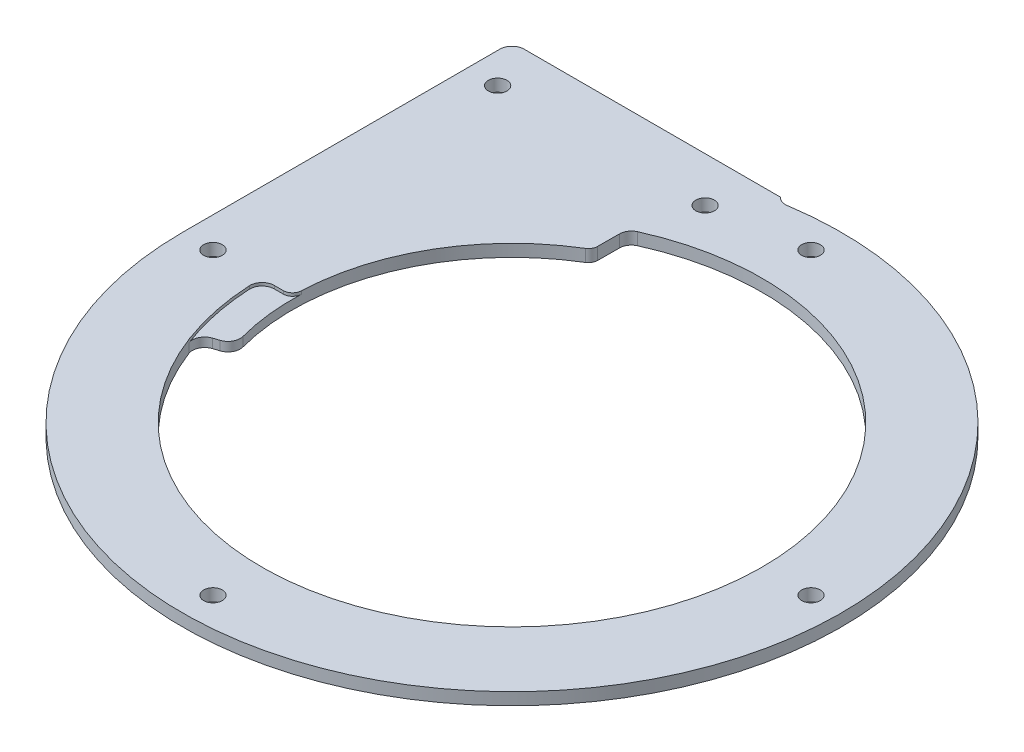
ISO-10303-21;
HEADER;
FILE_DESCRIPTION(('STEP AP214'),'2;1');
FILE_NAME('part.step','',(''),(''),'','','');
FILE_SCHEMA(('AUTOMOTIVE_DESIGN { 1 0 10303 214 1 1 1 1 }'));
ENDSEC;
DATA;
#1=APPLICATION_CONTEXT('core data for automotive mechanical design processes');
#2=APPLICATION_PROTOCOL_DEFINITION('international standard','automotive_design',2000,#1);
#3=PRODUCT_CONTEXT('',#1,'mechanical');
#4=PRODUCT('Part','Part','',(#3));
#5=PRODUCT_RELATED_PRODUCT_CATEGORY('part','',(#4));
#6=PRODUCT_DEFINITION_FORMATION('','',#4);
#7=PRODUCT_DEFINITION_CONTEXT('part definition',#1,'design');
#8=PRODUCT_DEFINITION('design','',#6,#7);
#9=PRODUCT_DEFINITION_SHAPE('','',#8);
#10=(LENGTH_UNIT() NAMED_UNIT(*) SI_UNIT(.MILLI.,.METRE.));
#11=(NAMED_UNIT(*) PLANE_ANGLE_UNIT() SI_UNIT($,.RADIAN.));
#12=(NAMED_UNIT(*) SI_UNIT($,.STERADIAN.) SOLID_ANGLE_UNIT());
#13=UNCERTAINTY_MEASURE_WITH_UNIT(LENGTH_MEASURE(1.E-05),#10,'distance_accuracy_value','');
#14=(GEOMETRIC_REPRESENTATION_CONTEXT(3) GLOBAL_UNCERTAINTY_ASSIGNED_CONTEXT((#13)) GLOBAL_UNIT_ASSIGNED_CONTEXT((#10,
#11,#12)) REPRESENTATION_CONTEXT('',''));
#15=CARTESIAN_POINT('',(0.,0.,0.));
#16=DIRECTION('',(0.,0.,1.));
#17=DIRECTION('',(1.,0.,0.));
#18=AXIS2_PLACEMENT_3D('',#15,#16,#17);
#19=CARTESIAN_POINT('',(-41.,45.4533796671224,0.));
#20=DIRECTION('',(0.,0.,-1.));
#21=DIRECTION('',(-1.,0.,0.));
#22=AXIS2_PLACEMENT_3D('',#19,#20,#21);
#23=PLANE('',#22);
#24=DIRECTION('',(1.,0.,0.));
#25=VECTOR('',#24,1.);
#26=CARTESIAN_POINT('',(-38.9486841883009,1.5,0.));
#27=LINE('',#26,#25);
#28=CARTESIAN_POINT('',(-38.9486841883009,1.5,0.));
#29=VERTEX_POINT('',#28);
#30=CARTESIAN_POINT('',(-37.4699879903904,1.5,0.));
#31=VERTEX_POINT('',#30);
#32=EDGE_CURVE('E177',#29,#31,#27,.T.);
#33=ORIENTED_EDGE('',*,*,#32,.T.);
#34=DIRECTION('',(0.,-1.,0.));
#35=VECTOR('',#34,1.);
#36=CARTESIAN_POINT('',(-37.4699879903904,45.4533796671224,0.));
#37=LINE('',#36,#35);
#38=CARTESIAN_POINT('',(-37.4699879903904,2.,0.));
#39=VERTEX_POINT('',#38);
#40=EDGE_CURVE('E161',#39,#31,#37,.T.);
#41=ORIENTED_EDGE('',*,*,#40,.F.);
#42=DIRECTION('',(1.,0.,0.));
#43=VECTOR('',#42,1.);
#44=CARTESIAN_POINT('',(-41.,2.,0.));
#45=LINE('',#44,#43);
#46=CARTESIAN_POINT('',(-38.9486841883009,2.,0.));
#47=VERTEX_POINT('',#46);
#48=EDGE_CURVE('E216',#47,#39,#45,.T.);
#49=ORIENTED_EDGE('',*,*,#48,.F.);
#50=DIRECTION('',(0.,-1.,0.));
#51=VECTOR('',#50,1.);
#52=CARTESIAN_POINT('',(-38.9486841883009,45.4533796671224,0.));
#53=LINE('',#52,#51);
#54=EDGE_CURVE('E181',#47,#29,#53,.T.);
#55=ORIENTED_EDGE('',*,*,#54,.T.);
#56=EDGE_LOOP('',(#33,#41,#49,#55));
#57=FACE_BOUND('',#56,.T.);
#58=ADVANCED_FACE('F44',(#57),#23,.F.);
#59=CARTESIAN_POINT('',(-37.4699879903904,45.4533796671224,-1.50000000000001));
#60=DIRECTION('',(0.,-1.,0.));
#61=DIRECTION('',(0.,0.,-1.));
#62=AXIS2_PLACEMENT_3D('',#59,#60,#61);
#63=CYLINDRICAL_SURFACE('',#62,1.50000000000001);
#64=CARTESIAN_POINT('',(-37.4699879903904,1.5,-1.50000000000001));
#65=DIRECTION('',(0.,1.,0.));
#66=DIRECTION('',(0.,0.,-1.));
#67=AXIS2_PLACEMENT_3D('',#64,#65,#66);
#68=CIRCLE('',#67,1.5);
#69=CARTESIAN_POINT('',(-35.9711884707748,1.5,-1.44000000000002));
#70=VERTEX_POINT('',#69);
#71=EDGE_CURVE('E170',#31,#70,#68,.T.);
#72=ORIENTED_EDGE('',*,*,#71,.T.);
#73=DIRECTION('',(0.,-1.,0.));
#74=VECTOR('',#73,1.);
#75=CARTESIAN_POINT('',(-35.9711884707748,45.4533796671224,-1.44000000000002));
#76=LINE('',#75,#74);
#77=CARTESIAN_POINT('',(-35.9711884707748,2.,-1.44000000000002));
#78=VERTEX_POINT('',#77);
#79=EDGE_CURVE('E172',#78,#70,#76,.T.);
#80=ORIENTED_EDGE('',*,*,#79,.F.);
#81=CARTESIAN_POINT('',(-37.4699879903904,2.,-1.50000000000001));
#82=DIRECTION('',(0.,1.,0.));
#83=DIRECTION('',(0.,0.,1.));
#84=AXIS2_PLACEMENT_3D('',#81,#82,#83);
#85=CIRCLE('',#84,1.50000000000001);
#86=EDGE_CURVE('E167',#39,#78,#85,.T.);
#87=ORIENTED_EDGE('',*,*,#86,.F.);
#88=ORIENTED_EDGE('',*,*,#40,.T.);
#89=EDGE_LOOP('',(#72,#80,#87,#88));
#90=FACE_BOUND('',#89,.T.);
#91=ADVANCED_FACE('F164',(#90),#63,.T.);
#92=CARTESIAN_POINT('',(0.,2.,0.));
#93=DIRECTION('',(0.,-1.,0.));
#94=DIRECTION('',(0.,0.,-1.));
#95=AXIS2_PLACEMENT_3D('',#92,#93,#94);
#96=CYLINDRICAL_SURFACE('',#95,41.);
#97=CARTESIAN_POINT('',(0.,0.,0.));
#98=DIRECTION('',(0.,1.,0.));
#99=DIRECTION('',(0.,0.,1.));
#100=AXIS2_PLACEMENT_3D('',#97,#98,#99);
#101=CIRCLE('',#100,41.);
#102=CARTESIAN_POINT('',(-38.2922821101508,0.,14.6526833991806));
#103=VERTEX_POINT('',#102);
#104=CARTESIAN_POINT('',(-16.7986572287805,0.,-37.4006031409915));
#105=VERTEX_POINT('',#104);
#106=EDGE_CURVE('E281',#103,#105,#101,.T.);
#107=ORIENTED_EDGE('',*,*,#106,.F.);
#108=DIRECTION('',(0.,-1.,0.));
#109=VECTOR('',#108,1.);
#110=CARTESIAN_POINT('',(-38.2922821101508,2.,14.6526833991806));
#111=LINE('',#110,#109);
#112=CARTESIAN_POINT('',(-38.2922821101508,1.5,14.6526833991806));
#113=VERTEX_POINT('',#112);
#114=EDGE_CURVE('E384',#103,#113,#111,.F.);
#115=ORIENTED_EDGE('',*,*,#114,.T.);
#116=CARTESIAN_POINT('',(0.,1.5,0.));
#117=DIRECTION('',(0.,-1.,0.));
#118=DIRECTION('',(0.,0.,-1.));
#119=AXIS2_PLACEMENT_3D('',#116,#117,#118);
#120=CIRCLE('',#119,41.);
#121=CARTESIAN_POINT('',(-40.9460526082138,1.5,2.10256410256411));
#122=VERTEX_POINT('',#121);
#123=EDGE_CURVE('E58',#113,#122,#120,.T.);
#124=ORIENTED_EDGE('',*,*,#123,.T.);
#125=DIRECTION('',(0.,-1.,0.));
#126=VECTOR('',#125,1.);
#127=CARTESIAN_POINT('',(-40.9460526082138,2.,2.10256410256411));
#128=LINE('',#127,#126);
#129=CARTESIAN_POINT('',(-40.9460526082138,2.,2.10256410256411));
#130=VERTEX_POINT('',#129);
#131=EDGE_CURVE('E322',#122,#130,#128,.F.);
#132=ORIENTED_EDGE('',*,*,#131,.T.);
#133=CARTESIAN_POINT('',(0.,2.,0.));
#134=DIRECTION('',(0.,1.,0.));
#135=DIRECTION('',(0.,0.,1.));
#136=AXIS2_PLACEMENT_3D('',#133,#134,#135);
#137=CIRCLE('',#136,41.);
#138=CARTESIAN_POINT('',(-16.7986572287805,2.,-37.4006031409915));
#139=VERTEX_POINT('',#138);
#140=EDGE_CURVE('E290',#130,#139,#137,.T.);
#141=ORIENTED_EDGE('',*,*,#140,.T.);
#142=DIRECTION('',(0.,-1.,0.));
#143=VECTOR('',#142,1.);
#144=CARTESIAN_POINT('',(-16.7986572287805,2.,-37.4006031409915));
#145=LINE('',#144,#143);
#146=EDGE_CURVE('E328',#139,#105,#145,.T.);
#147=ORIENTED_EDGE('',*,*,#146,.T.);
#148=EDGE_LOOP('',(#107,#115,#124,#132,#141,#147));
#149=FACE_BOUND('',#148,.T.);
#150=ADVANCED_FACE('F400',(#149),#96,.F.);
#151=CARTESIAN_POINT('',(0.,2.,0.));
#152=DIRECTION('',(0.,1.,0.));
#153=DIRECTION('',(0.,0.,1.));
#154=AXIS2_PLACEMENT_3D('',#151,#152,#153);
#155=PLANE('',#154);
#156=CARTESIAN_POINT('',(-49.,2.,0.));
#157=DIRECTION('',(0.,1.,0.));
#158=DIRECTION('',(0.,0.,1.));
#159=AXIS2_PLACEMENT_3D('',#156,#157,#158);
#160=CIRCLE('',#159,1.525);
#161=CARTESIAN_POINT('',(-49.,2.,1.525));
#162=VERTEX_POINT('',#161);
#163=EDGE_CURVE('E250',#162,#162,#160,.T.);
#164=ORIENTED_EDGE('',*,*,#163,.F.);
#165=EDGE_LOOP('',(#164));
#166=FACE_BOUND('',#165,.T.);
#167=CARTESIAN_POINT('',(49.,2.,0.));
#168=DIRECTION('',(0.,1.,0.));
#169=DIRECTION('',(0.,0.,1.));
#170=AXIS2_PLACEMENT_3D('',#167,#168,#169);
#171=CIRCLE('',#170,1.525);
#172=CARTESIAN_POINT('',(49.,2.,1.52499999999999));
#173=VERTEX_POINT('',#172);
#174=EDGE_CURVE('E261',#173,#173,#171,.T.);
#175=ORIENTED_EDGE('',*,*,#174,.F.);
#176=EDGE_LOOP('',(#175));
#177=FACE_BOUND('',#176,.T.);
#178=CARTESIAN_POINT('',(-15.,2.,-46.6476151587624));
#179=DIRECTION('',(0.,1.,0.));
#180=DIRECTION('',(0.,0.,1.));
#181=AXIS2_PLACEMENT_3D('',#178,#179,#180);
#182=CIRCLE('',#181,1.525);
#183=CARTESIAN_POINT('',(-15.,2.,-45.1226151587624));
#184=VERTEX_POINT('',#183);
#185=EDGE_CURVE('E280',#184,#184,#182,.T.);
#186=ORIENTED_EDGE('',*,*,#185,.F.);
#187=EDGE_LOOP('',(#186));
#188=FACE_BOUND('',#187,.T.);
#189=DIRECTION('',(-1.,0.,0.));
#190=VECTOR('',#189,1.);
#191=CARTESIAN_POINT('',(-54.,2.,-54.));
#192=LINE('',#191,#190);
#193=CARTESIAN_POINT('',(-10.,2.,-54.));
#194=VERTEX_POINT('',#193);
#195=CARTESIAN_POINT('',(-52.,2.,-54.));
#196=VERTEX_POINT('',#195);
#197=EDGE_CURVE('E296',#194,#196,#192,.T.);
#198=ORIENTED_EDGE('',*,*,#197,.T.);
#199=CARTESIAN_POINT('',(-52.,2.,-52.));
#200=DIRECTION('',(0.,1.,0.));
#201=DIRECTION('',(0.,0.,1.));
#202=AXIS2_PLACEMENT_3D('',#199,#200,#201);
#203=CIRCLE('',#202,2.);
#204=CARTESIAN_POINT('',(-54.,2.,-52.));
#205=VERTEX_POINT('',#204);
#206=EDGE_CURVE('E353',#196,#205,#203,.T.);
#207=ORIENTED_EDGE('',*,*,#206,.T.);
#208=DIRECTION('',(0.,0.,1.));
#209=VECTOR('',#208,1.);
#210=CARTESIAN_POINT('',(-54.,2.,0.));
#211=LINE('',#210,#209);
#212=CARTESIAN_POINT('',(-54.,2.,0.));
#213=VERTEX_POINT('',#212);
#214=EDGE_CURVE('E303',#205,#213,#211,.T.);
#215=ORIENTED_EDGE('',*,*,#214,.T.);
#216=CARTESIAN_POINT('',(0.,2.,0.));
#217=DIRECTION('',(0.,1.,0.));
#218=DIRECTION('',(0.,0.,1.));
#219=AXIS2_PLACEMENT_3D('',#216,#217,#218);
#220=CIRCLE('',#219,54.);
#221=CARTESIAN_POINT('',(-8.21791887795999,2.,-53.3710203136053));
#222=VERTEX_POINT('',#221);
#223=EDGE_CURVE('E295',#213,#222,#220,.T.);
#224=ORIENTED_EDGE('',*,*,#223,.T.);
#225=CARTESIAN_POINT('',(-8.52228624381037,2.,-55.3477247696648));
#226=DIRECTION('',(0.,1.,0.));
#227=DIRECTION('',(0.,0.,1.));
#228=AXIS2_PLACEMENT_3D('',#225,#226,#227);
#229=CIRCLE('',#228,2.);
#230=EDGE_CURVE('E361',#222,#194,#229,.F.);
#231=ORIENTED_EDGE('',*,*,#230,.T.);
#232=EDGE_LOOP('',(#198,#207,#215,#224,#231));
#233=FACE_BOUND('',#232,.T.);
#234=ORIENTED_EDGE('',*,*,#140,.F.);
#235=CARTESIAN_POINT('',(-38.9486841883009,2.,2.00000000000001));
#236=DIRECTION('',(0.,1.,0.));
#237=DIRECTION('',(0.,0.,1.));
#238=AXIS2_PLACEMENT_3D('',#235,#236,#237);
#239=CIRCLE('',#238,2.);
#240=EDGE_CURVE('E343',#130,#47,#239,.F.);
#241=ORIENTED_EDGE('',*,*,#240,.T.);
#242=ORIENTED_EDGE('',*,*,#48,.T.);
#243=ORIENTED_EDGE('',*,*,#86,.T.);
#244=CARTESIAN_POINT('',(0.,2.,0.));
#245=DIRECTION('',(0.,1.,0.));
#246=DIRECTION('',(0.,0.,1.));
#247=AXIS2_PLACEMENT_3D('',#244,#245,#246);
#248=CIRCLE('',#247,36.);
#249=CARTESIAN_POINT('',(-18.7161333475187,2.,-30.7523389763754));
#250=VERTEX_POINT('',#249);
#251=EDGE_CURVE('E207',#78,#250,#248,.F.);
#252=ORIENTED_EDGE('',*,*,#251,.T.);
#253=CARTESIAN_POINT('',(-19.4959722369986,2.,-32.0336864337244));
#254=DIRECTION('',(0.,1.,0.));
#255=DIRECTION('',(0.,0.,1.));
#256=AXIS2_PLACEMENT_3D('',#253,#254,#255);
#257=CIRCLE('',#256,1.5);
#258=CARTESIAN_POINT('',(-17.9959889497554,2.,-32.0266056152006));
#259=VERTEX_POINT('',#258);
#260=EDGE_CURVE('E224',#250,#259,#257,.T.);
#261=ORIENTED_EDGE('',*,*,#260,.T.);
#262=DIRECTION('',(0.00472054568255677,0.,-0.999988858162159));
#263=VECTOR('',#262,1.);
#264=CARTESIAN_POINT('',(-17.9959889497554,2.,-32.0266056152006));
#265=LINE('',#264,#263);
#266=CARTESIAN_POINT('',(-17.9791882510179,2.,-35.5856245669424));
#267=VERTEX_POINT('',#266);
#268=EDGE_CURVE('E221',#259,#267,#265,.T.);
#269=ORIENTED_EDGE('',*,*,#268,.T.);
#270=CARTESIAN_POINT('',(-15.9792105346936,2.,-35.5761834755773));
#271=DIRECTION('',(0.,1.,0.));
#272=DIRECTION('',(0.,0.,1.));
#273=AXIS2_PLACEMENT_3D('',#270,#271,#272);
#274=CIRCLE('',#273,2.);
#275=EDGE_CURVE('E336',#267,#139,#274,.F.);
#276=ORIENTED_EDGE('',*,*,#275,.T.);
#277=EDGE_LOOP('',(#234,#241,#242,#243,#252,#261,#269,#276));
#278=FACE_BOUND('',#277,.T.);
#279=CARTESIAN_POINT('',(0.,2.,-49.));
#280=DIRECTION('',(0.,1.,0.));
#281=DIRECTION('',(0.,0.,1.));
#282=AXIS2_PLACEMENT_3D('',#279,#280,#281);
#283=CIRCLE('',#282,1.525);
#284=CARTESIAN_POINT('',(0.,2.,-47.475));
#285=VERTEX_POINT('',#284);
#286=EDGE_CURVE('E272',#285,#285,#283,.T.);
#287=ORIENTED_EDGE('',*,*,#286,.F.);
#288=EDGE_LOOP('',(#287));
#289=FACE_BOUND('',#288,.T.);
#290=CARTESIAN_POINT('',(0.,2.,49.));
#291=DIRECTION('',(0.,1.,0.));
#292=DIRECTION('',(0.,0.,1.));
#293=AXIS2_PLACEMENT_3D('',#290,#291,#292);
#294=CIRCLE('',#293,1.525);
#295=CARTESIAN_POINT('',(0.,2.,50.525));
#296=VERTEX_POINT('',#295);
#297=EDGE_CURVE('E253',#296,#296,#294,.T.);
#298=ORIENTED_EDGE('',*,*,#297,.F.);
#299=EDGE_LOOP('',(#298));
#300=FACE_BOUND('',#299,.T.);
#301=CARTESIAN_POINT('',(-49.,2.,-46.6476151587624));
#302=DIRECTION('',(0.,1.,0.));
#303=DIRECTION('',(0.,0.,1.));
#304=AXIS2_PLACEMENT_3D('',#301,#302,#303);
#305=CIRCLE('',#304,1.525);
#306=CARTESIAN_POINT('',(-49.,2.,-45.1226151587624));
#307=VERTEX_POINT('',#306);
#308=EDGE_CURVE('E237',#307,#307,#305,.T.);
#309=ORIENTED_EDGE('',*,*,#308,.F.);
#310=EDGE_LOOP('',(#309));
#311=FACE_BOUND('',#310,.T.);
#312=ADVANCED_FACE('F420',(#166,#177,#188,#233,#278,#289,#300,#311),#155,.T.);
#313=CARTESIAN_POINT('',(0.,0.,0.));
#314=DIRECTION('',(0.,1.,0.));
#315=DIRECTION('',(0.,0.,1.));
#316=AXIS2_PLACEMENT_3D('',#313,#314,#315);
#317=PLANE('',#316);
#318=CARTESIAN_POINT('',(0.,0.,0.));
#319=DIRECTION('',(0.,-1.,0.));
#320=DIRECTION('',(0.,0.,1.));
#321=AXIS2_PLACEMENT_3D('',#318,#319,#320);
#322=CIRCLE('',#321,36.);
#323=CARTESIAN_POINT('',(-34.7760864845078,0.,9.30719124236937));
#324=VERTEX_POINT('',#323);
#325=CARTESIAN_POINT('',(-18.7161333475187,0.,-30.7523389763754));
#326=VERTEX_POINT('',#325);
#327=EDGE_CURVE('E202',#324,#326,#322,.T.);
#328=ORIENTED_EDGE('',*,*,#327,.F.);
#329=CARTESIAN_POINT('',(-36.7080912892026,0.,9.82425742250101));
#330=DIRECTION('',(0.,1.,0.));
#331=DIRECTION('',(0.,0.,1.));
#332=AXIS2_PLACEMENT_3D('',#329,#330,#331);
#333=CIRCLE('',#332,2.);
#334=CARTESIAN_POINT('',(-36.0900573004527,0.,11.7263704550913));
#335=VERTEX_POINT('',#334);
#336=EDGE_CURVE('E369',#324,#335,#333,.F.);
#337=ORIENTED_EDGE('',*,*,#336,.T.);
#338=DIRECTION('',(-0.951056516295153,0.,0.309016994374948));
#339=VECTOR('',#338,1.);
#340=CARTESIAN_POINT('',(-34.2380345866255,0.,11.1246117974981));
#341=LINE('',#340,#339);
#342=CARTESIAN_POINT('',(-37.0423998984056,0.,12.0358053227278));
#343=VERTEX_POINT('',#342);
#344=EDGE_CURVE('E199',#335,#343,#341,.T.);
#345=ORIENTED_EDGE('',*,*,#344,.T.);
#346=CARTESIAN_POINT('',(-36.4243659096557,0.,13.9379183553181));
#347=DIRECTION('',(0.,1.,0.));
#348=DIRECTION('',(0.,0.,1.));
#349=AXIS2_PLACEMENT_3D('',#346,#347,#348);
#350=CIRCLE('',#349,2.);
#351=EDGE_CURVE('E53',#343,#103,#350,.T.);
#352=ORIENTED_EDGE('',*,*,#351,.T.);
#353=ORIENTED_EDGE('',*,*,#106,.T.);
#354=CARTESIAN_POINT('',(-15.9792105346936,0.,-35.5761834755773));
#355=DIRECTION('',(0.,1.,0.));
#356=DIRECTION('',(0.,0.,1.));
#357=AXIS2_PLACEMENT_3D('',#354,#355,#356);
#358=CIRCLE('',#357,2.);
#359=CARTESIAN_POINT('',(-17.9791882510179,0.,-35.5856245669424));
#360=VERTEX_POINT('',#359);
#361=EDGE_CURVE('E334',#105,#360,#358,.T.);
#362=ORIENTED_EDGE('',*,*,#361,.T.);
#363=DIRECTION('',(0.00472054568255677,0.,-0.999988858162159));
#364=VECTOR('',#363,1.);
#365=CARTESIAN_POINT('',(-17.9959889497554,0.,-32.0266056152006));
#366=LINE('',#365,#364);
#367=CARTESIAN_POINT('',(-17.9959889497554,0.,-32.0266056152006));
#368=VERTEX_POINT('',#367);
#369=EDGE_CURVE('E174',#368,#360,#366,.T.);
#370=ORIENTED_EDGE('',*,*,#369,.F.);
#371=CARTESIAN_POINT('',(-19.4959722369986,0.,-32.0336864337244));
#372=DIRECTION('',(0.,1.,0.));
#373=DIRECTION('',(0.,0.,1.));
#374=AXIS2_PLACEMENT_3D('',#371,#372,#373);
#375=CIRCLE('',#374,1.5);
#376=EDGE_CURVE('E213',#326,#368,#375,.T.);
#377=ORIENTED_EDGE('',*,*,#376,.F.);
#378=EDGE_LOOP('',(#328,#337,#345,#352,#353,#362,#370,#377));
#379=FACE_BOUND('',#378,.T.);
#380=DIRECTION('',(0.,0.,1.));
#381=VECTOR('',#380,1.);
#382=CARTESIAN_POINT('',(-54.,0.,0.));
#383=LINE('',#382,#381);
#384=CARTESIAN_POINT('',(-54.,0.,-52.));
#385=VERTEX_POINT('',#384);
#386=CARTESIAN_POINT('',(-54.,0.,0.));
#387=VERTEX_POINT('',#386);
#388=EDGE_CURVE('E299',#385,#387,#383,.T.);
#389=ORIENTED_EDGE('',*,*,#388,.F.);
#390=CARTESIAN_POINT('',(-52.,0.,-52.));
#391=DIRECTION('',(0.,1.,0.));
#392=DIRECTION('',(0.,0.,1.));
#393=AXIS2_PLACEMENT_3D('',#390,#391,#392);
#394=CIRCLE('',#393,2.);
#395=CARTESIAN_POINT('',(-52.,0.,-54.));
#396=VERTEX_POINT('',#395);
#397=EDGE_CURVE('E346',#385,#396,#394,.F.);
#398=ORIENTED_EDGE('',*,*,#397,.T.);
#399=DIRECTION('',(-1.,0.,0.));
#400=VECTOR('',#399,1.);
#401=CARTESIAN_POINT('',(-54.,0.,-54.));
#402=LINE('',#401,#400);
#403=CARTESIAN_POINT('',(-10.,0.,-54.));
#404=VERTEX_POINT('',#403);
#405=EDGE_CURVE('E309',#404,#396,#402,.T.);
#406=ORIENTED_EDGE('',*,*,#405,.F.);
#407=CARTESIAN_POINT('',(-8.52228624381037,0.,-55.3477247696648));
#408=DIRECTION('',(0.,1.,0.));
#409=DIRECTION('',(0.,0.,1.));
#410=AXIS2_PLACEMENT_3D('',#407,#408,#409);
#411=CIRCLE('',#410,2.);
#412=CARTESIAN_POINT('',(-8.21791887795999,0.,-53.3710203136053));
#413=VERTEX_POINT('',#412);
#414=EDGE_CURVE('E359',#404,#413,#411,.T.);
#415=ORIENTED_EDGE('',*,*,#414,.T.);
#416=CARTESIAN_POINT('',(0.,0.,0.));
#417=DIRECTION('',(0.,1.,0.));
#418=DIRECTION('',(0.,0.,1.));
#419=AXIS2_PLACEMENT_3D('',#416,#417,#418);
#420=CIRCLE('',#419,54.);
#421=EDGE_CURVE('E293',#387,#413,#420,.T.);
#422=ORIENTED_EDGE('',*,*,#421,.F.);
#423=EDGE_LOOP('',(#389,#398,#406,#415,#422));
#424=FACE_BOUND('',#423,.T.);
#425=CARTESIAN_POINT('',(-15.,0.,-46.6476151587624));
#426=DIRECTION('',(0.,1.,0.));
#427=DIRECTION('',(0.,0.,1.));
#428=AXIS2_PLACEMENT_3D('',#425,#426,#427);
#429=CIRCLE('',#428,1.525);
#430=CARTESIAN_POINT('',(-15.,0.,-45.1226151587624));
#431=VERTEX_POINT('',#430);
#432=EDGE_CURVE('E273',#431,#431,#429,.T.);
#433=ORIENTED_EDGE('',*,*,#432,.T.);
#434=EDGE_LOOP('',(#433));
#435=FACE_BOUND('',#434,.T.);
#436=CARTESIAN_POINT('',(0.,0.,-49.));
#437=DIRECTION('',(0.,1.,0.));
#438=DIRECTION('',(0.,0.,1.));
#439=AXIS2_PLACEMENT_3D('',#436,#437,#438);
#440=CIRCLE('',#439,1.525);
#441=CARTESIAN_POINT('',(0.,0.,-47.475));
#442=VERTEX_POINT('',#441);
#443=EDGE_CURVE('E270',#442,#442,#440,.T.);
#444=ORIENTED_EDGE('',*,*,#443,.T.);
#445=EDGE_LOOP('',(#444));
#446=FACE_BOUND('',#445,.T.);
#447=CARTESIAN_POINT('',(49.,0.,0.));
#448=DIRECTION('',(0.,1.,0.));
#449=DIRECTION('',(0.,0.,1.));
#450=AXIS2_PLACEMENT_3D('',#447,#448,#449);
#451=CIRCLE('',#450,1.525);
#452=CARTESIAN_POINT('',(49.,0.,1.52499999999999));
#453=VERTEX_POINT('',#452);
#454=EDGE_CURVE('E260',#453,#453,#451,.T.);
#455=ORIENTED_EDGE('',*,*,#454,.T.);
#456=EDGE_LOOP('',(#455));
#457=FACE_BOUND('',#456,.T.);
#458=CARTESIAN_POINT('',(0.,0.,49.));
#459=DIRECTION('',(0.,1.,0.));
#460=DIRECTION('',(0.,0.,1.));
#461=AXIS2_PLACEMENT_3D('',#458,#459,#460);
#462=CIRCLE('',#461,1.525);
#463=CARTESIAN_POINT('',(0.,0.,50.525));
#464=VERTEX_POINT('',#463);
#465=EDGE_CURVE('E252',#464,#464,#462,.T.);
#466=ORIENTED_EDGE('',*,*,#465,.T.);
#467=EDGE_LOOP('',(#466));
#468=FACE_BOUND('',#467,.T.);
#469=CARTESIAN_POINT('',(-49.,0.,0.));
#470=DIRECTION('',(0.,1.,0.));
#471=DIRECTION('',(0.,0.,1.));
#472=AXIS2_PLACEMENT_3D('',#469,#470,#471);
#473=CIRCLE('',#472,1.525);
#474=CARTESIAN_POINT('',(-49.,0.,1.525));
#475=VERTEX_POINT('',#474);
#476=EDGE_CURVE('E243',#475,#475,#473,.T.);
#477=ORIENTED_EDGE('',*,*,#476,.T.);
#478=EDGE_LOOP('',(#477));
#479=FACE_BOUND('',#478,.T.);
#480=CARTESIAN_POINT('',(-49.,0.,-46.6476151587624));
#481=DIRECTION('',(0.,1.,0.));
#482=DIRECTION('',(0.,0.,1.));
#483=AXIS2_PLACEMENT_3D('',#480,#481,#482);
#484=CIRCLE('',#483,1.525);
#485=CARTESIAN_POINT('',(-49.,0.,-45.1226151587624));
#486=VERTEX_POINT('',#485);
#487=EDGE_CURVE('E220',#486,#486,#484,.T.);
#488=ORIENTED_EDGE('',*,*,#487,.T.);
#489=EDGE_LOOP('',(#488));
#490=FACE_BOUND('',#489,.T.);
#491=ADVANCED_FACE('F390',(#379,#424,#435,#446,#457,#468,#479,#490),#317,.F.);
#492=CARTESIAN_POINT('',(0.,2.,0.));
#493=DIRECTION('',(0.,-1.,0.));
#494=DIRECTION('',(0.,0.,-1.));
#495=AXIS2_PLACEMENT_3D('',#492,#493,#494);
#496=CYLINDRICAL_SURFACE('',#495,54.);
#497=ORIENTED_EDGE('',*,*,#421,.T.);
#498=DIRECTION('',(0.,-1.,0.));
#499=VECTOR('',#498,1.);
#500=CARTESIAN_POINT('',(-8.21791887795999,2.,-53.3710203136053));
#501=LINE('',#500,#499);
#502=EDGE_CURVE('E357',#413,#222,#501,.F.);
#503=ORIENTED_EDGE('',*,*,#502,.T.);
#504=ORIENTED_EDGE('',*,*,#223,.F.);
#505=DIRECTION('',(0.,-1.,0.));
#506=VECTOR('',#505,1.);
#507=CARTESIAN_POINT('',(-54.,2.,0.));
#508=LINE('',#507,#506);
#509=EDGE_CURVE('E306',#213,#387,#508,.T.);
#510=ORIENTED_EDGE('',*,*,#509,.T.);
#511=EDGE_LOOP('',(#497,#503,#504,#510));
#512=FACE_BOUND('',#511,.T.);
#513=ADVANCED_FACE('F468',(#512),#496,.T.);
#514=CARTESIAN_POINT('',(-54.,2.,-54.));
#515=DIRECTION('',(0.,0.,1.));
#516=DIRECTION('',(1.,0.,0.));
#517=AXIS2_PLACEMENT_3D('',#514,#515,#516);
#518=PLANE('',#517);
#519=ORIENTED_EDGE('',*,*,#405,.T.);
#520=DIRECTION('',(0.,-1.,0.));
#521=VECTOR('',#520,1.);
#522=CARTESIAN_POINT('',(-52.,2.,-54.));
#523=LINE('',#522,#521);
#524=EDGE_CURVE('E351',#396,#196,#523,.F.);
#525=ORIENTED_EDGE('',*,*,#524,.T.);
#526=ORIENTED_EDGE('',*,*,#197,.F.);
#527=DIRECTION('',(0.,-1.,0.));
#528=VECTOR('',#527,1.);
#529=CARTESIAN_POINT('',(-10.,2.,-54.));
#530=LINE('',#529,#528);
#531=EDGE_CURVE('E316',#194,#404,#530,.T.);
#532=ORIENTED_EDGE('',*,*,#531,.T.);
#533=EDGE_LOOP('',(#519,#525,#526,#532));
#534=FACE_BOUND('',#533,.T.);
#535=ADVANCED_FACE('F472',(#534),#518,.F.);
#536=CARTESIAN_POINT('',(-54.,2.,0.));
#537=DIRECTION('',(1.,0.,0.));
#538=DIRECTION('',(0.,0.,-1.));
#539=AXIS2_PLACEMENT_3D('',#536,#537,#538);
#540=PLANE('',#539);
#541=ORIENTED_EDGE('',*,*,#214,.F.);
#542=DIRECTION('',(0.,-1.,0.));
#543=VECTOR('',#542,1.);
#544=CARTESIAN_POINT('',(-54.,2.,-52.));
#545=LINE('',#544,#543);
#546=EDGE_CURVE('E345',#205,#385,#545,.T.);
#547=ORIENTED_EDGE('',*,*,#546,.T.);
#548=ORIENTED_EDGE('',*,*,#388,.T.);
#549=ORIENTED_EDGE('',*,*,#509,.F.);
#550=EDGE_LOOP('',(#541,#547,#548,#549));
#551=FACE_BOUND('',#550,.T.);
#552=ADVANCED_FACE('F480',(#551),#540,.F.);
#553=CARTESIAN_POINT('',(-15.,2.,-46.6476151587624));
#554=DIRECTION('',(0.,-1.,0.));
#555=DIRECTION('',(0.,0.,-1.));
#556=AXIS2_PLACEMENT_3D('',#553,#554,#555);
#557=CYLINDRICAL_SURFACE('',#556,1.525);
#558=ORIENTED_EDGE('',*,*,#185,.T.);
#559=EDGE_LOOP('',(#558));
#560=FACE_BOUND('',#559,.T.);
#561=ORIENTED_EDGE('',*,*,#432,.F.);
#562=EDGE_LOOP('',(#561));
#563=FACE_BOUND('',#562,.T.);
#564=ADVANCED_FACE('F481',(#560,#563),#557,.F.);
#565=CARTESIAN_POINT('',(0.,2.,-49.));
#566=DIRECTION('',(0.,-1.,0.));
#567=DIRECTION('',(0.,0.,-1.));
#568=AXIS2_PLACEMENT_3D('',#565,#566,#567);
#569=CYLINDRICAL_SURFACE('',#568,1.525);
#570=ORIENTED_EDGE('',*,*,#286,.T.);
#571=EDGE_LOOP('',(#570));
#572=FACE_BOUND('',#571,.T.);
#573=ORIENTED_EDGE('',*,*,#443,.F.);
#574=EDGE_LOOP('',(#573));
#575=FACE_BOUND('',#574,.T.);
#576=ADVANCED_FACE('F495',(#572,#575),#569,.F.);
#577=CARTESIAN_POINT('',(49.,2.,0.));
#578=DIRECTION('',(0.,-1.,0.));
#579=DIRECTION('',(0.,0.,-1.));
#580=AXIS2_PLACEMENT_3D('',#577,#578,#579);
#581=CYLINDRICAL_SURFACE('',#580,1.525);
#582=ORIENTED_EDGE('',*,*,#174,.T.);
#583=EDGE_LOOP('',(#582));
#584=FACE_BOUND('',#583,.T.);
#585=ORIENTED_EDGE('',*,*,#454,.F.);
#586=EDGE_LOOP('',(#585));
#587=FACE_BOUND('',#586,.T.);
#588=ADVANCED_FACE('F496',(#584,#587),#581,.F.);
#589=CARTESIAN_POINT('',(0.,2.,49.));
#590=DIRECTION('',(0.,-1.,0.));
#591=DIRECTION('',(0.,0.,-1.));
#592=AXIS2_PLACEMENT_3D('',#589,#590,#591);
#593=CYLINDRICAL_SURFACE('',#592,1.525);
#594=ORIENTED_EDGE('',*,*,#297,.T.);
#595=EDGE_LOOP('',(#594));
#596=FACE_BOUND('',#595,.T.);
#597=ORIENTED_EDGE('',*,*,#465,.F.);
#598=EDGE_LOOP('',(#597));
#599=FACE_BOUND('',#598,.T.);
#600=ADVANCED_FACE('F499',(#596,#599),#593,.F.);
#601=CARTESIAN_POINT('',(-49.,2.,0.));
#602=DIRECTION('',(0.,-1.,0.));
#603=DIRECTION('',(0.,0.,-1.));
#604=AXIS2_PLACEMENT_3D('',#601,#602,#603);
#605=CYLINDRICAL_SURFACE('',#604,1.525);
#606=ORIENTED_EDGE('',*,*,#163,.T.);
#607=EDGE_LOOP('',(#606));
#608=FACE_BOUND('',#607,.T.);
#609=ORIENTED_EDGE('',*,*,#476,.F.);
#610=EDGE_LOOP('',(#609));
#611=FACE_BOUND('',#610,.T.);
#612=ADVANCED_FACE('F502',(#608,#611),#605,.F.);
#613=CARTESIAN_POINT('',(-49.,2.,-46.6476151587624));
#614=DIRECTION('',(0.,-1.,0.));
#615=DIRECTION('',(0.,0.,-1.));
#616=AXIS2_PLACEMENT_3D('',#613,#614,#615);
#617=CYLINDRICAL_SURFACE('',#616,1.525);
#618=ORIENTED_EDGE('',*,*,#308,.T.);
#619=EDGE_LOOP('',(#618));
#620=FACE_BOUND('',#619,.T.);
#621=ORIENTED_EDGE('',*,*,#487,.F.);
#622=EDGE_LOOP('',(#621));
#623=FACE_BOUND('',#622,.T.);
#624=ADVANCED_FACE('F439',(#620,#623),#617,.F.);
#625=CARTESIAN_POINT('',(-19.4959722369986,45.4533796671224,-32.0336864337244));
#626=DIRECTION('',(0.,-1.,0.));
#627=DIRECTION('',(0.,0.,-1.));
#628=AXIS2_PLACEMENT_3D('',#625,#626,#627);
#629=CYLINDRICAL_SURFACE('',#628,1.5);
#630=ORIENTED_EDGE('',*,*,#260,.F.);
#631=DIRECTION('',(0.,-1.,0.));
#632=VECTOR('',#631,1.);
#633=CARTESIAN_POINT('',(-18.7161333475187,45.4533796671224,-30.7523389763754));
#634=LINE('',#633,#632);
#635=EDGE_CURVE('E196',#250,#326,#634,.T.);
#636=ORIENTED_EDGE('',*,*,#635,.T.);
#637=ORIENTED_EDGE('',*,*,#376,.T.);
#638=DIRECTION('',(0.,-1.,0.));
#639=VECTOR('',#638,1.);
#640=CARTESIAN_POINT('',(-17.9959889497554,45.4533796671224,-32.0266056152006));
#641=LINE('',#640,#639);
#642=EDGE_CURVE('E208',#259,#368,#641,.T.);
#643=ORIENTED_EDGE('',*,*,#642,.F.);
#644=EDGE_LOOP('',(#630,#636,#637,#643));
#645=FACE_BOUND('',#644,.T.);
#646=ADVANCED_FACE('F411',(#645),#629,.T.);
#647=CARTESIAN_POINT('',(-17.9959889497554,45.4533796671224,-32.0266056152006));
#648=DIRECTION('',(-0.999988858162159,0.,-0.00472054568255677));
#649=DIRECTION('',(-0.00472054568255677,0.,0.999988858162159));
#650=AXIS2_PLACEMENT_3D('',#647,#648,#649);
#651=PLANE('',#650);
#652=ORIENTED_EDGE('',*,*,#369,.T.);
#653=DIRECTION('',(0.,-1.,0.));
#654=VECTOR('',#653,1.);
#655=CARTESIAN_POINT('',(-17.9791882510179,45.4533796671224,-35.5856245669424));
#656=LINE('',#655,#654);
#657=EDGE_CURVE('E327',#360,#267,#656,.F.);
#658=ORIENTED_EDGE('',*,*,#657,.T.);
#659=ORIENTED_EDGE('',*,*,#268,.F.);
#660=ORIENTED_EDGE('',*,*,#642,.T.);
#661=EDGE_LOOP('',(#652,#658,#659,#660));
#662=FACE_BOUND('',#661,.T.);
#663=ADVANCED_FACE('F431',(#662),#651,.F.);
#664=CARTESIAN_POINT('',(0.,45.4533796671224,0.));
#665=DIRECTION('',(0.,-1.,0.));
#666=DIRECTION('',(0.,0.,-1.));
#667=AXIS2_PLACEMENT_3D('',#664,#665,#666);
#668=CYLINDRICAL_SURFACE('',#667,36.);
#669=CARTESIAN_POINT('',(0.,1.5,0.));
#670=DIRECTION('',(0.,1.,0.));
#671=DIRECTION('',(0.,0.,-1.));
#672=AXIS2_PLACEMENT_3D('',#669,#670,#671);
#673=CIRCLE('',#672,36.);
#674=CARTESIAN_POINT('',(-34.7760864845078,1.5,9.30719124236937));
#675=VERTEX_POINT('',#674);
#676=EDGE_CURVE('E189',#70,#675,#673,.T.);
#677=ORIENTED_EDGE('',*,*,#676,.T.);
#678=DIRECTION('',(0.,-1.,0.));
#679=VECTOR('',#678,1.);
#680=CARTESIAN_POINT('',(-34.7760864845078,45.4533796671224,9.30719124236937));
#681=LINE('',#680,#679);
#682=EDGE_CURVE('E366',#675,#324,#681,.T.);
#683=ORIENTED_EDGE('',*,*,#682,.T.);
#684=ORIENTED_EDGE('',*,*,#327,.T.);
#685=ORIENTED_EDGE('',*,*,#635,.F.);
#686=ORIENTED_EDGE('',*,*,#251,.F.);
#687=ORIENTED_EDGE('',*,*,#79,.T.);
#688=EDGE_LOOP('',(#677,#683,#684,#685,#686,#687));
#689=FACE_BOUND('',#688,.T.);
#690=ADVANCED_FACE('F409',(#689),#668,.F.);
#691=CARTESIAN_POINT('',(-15.9792105346936,2.,-35.5761834755773));
#692=DIRECTION('',(0.,-1.,0.));
#693=DIRECTION('',(0.,0.,-1.));
#694=AXIS2_PLACEMENT_3D('',#691,#692,#693);
#695=CYLINDRICAL_SURFACE('',#694,2.);
#696=ORIENTED_EDGE('',*,*,#275,.F.);
#697=ORIENTED_EDGE('',*,*,#657,.F.);
#698=ORIENTED_EDGE('',*,*,#361,.F.);
#699=ORIENTED_EDGE('',*,*,#146,.F.);
#700=EDGE_LOOP('',(#696,#697,#698,#699));
#701=FACE_BOUND('',#700,.T.);
#702=ADVANCED_FACE('F429',(#701),#695,.F.);
#703=CARTESIAN_POINT('',(-38.9486841883009,2.,2.00000000000001));
#704=DIRECTION('',(0.,-1.,0.));
#705=DIRECTION('',(0.,0.,-1.));
#706=AXIS2_PLACEMENT_3D('',#703,#704,#705);
#707=CYLINDRICAL_SURFACE('',#706,2.);
#708=ORIENTED_EDGE('',*,*,#131,.F.);
#709=CARTESIAN_POINT('',(-38.9486841883009,1.5,2.00000000000001));
#710=DIRECTION('',(0.,-1.,0.));
#711=DIRECTION('',(0.,0.,-1.));
#712=AXIS2_PLACEMENT_3D('',#709,#710,#711);
#713=CIRCLE('',#712,2.);
#714=EDGE_CURVE('E182',#122,#29,#713,.T.);
#715=ORIENTED_EDGE('',*,*,#714,.T.);
#716=ORIENTED_EDGE('',*,*,#54,.F.);
#717=ORIENTED_EDGE('',*,*,#240,.F.);
#718=EDGE_LOOP('',(#708,#715,#716,#717));
#719=FACE_BOUND('',#718,.T.);
#720=ADVANCED_FACE('F422',(#719),#707,.F.);
#721=CARTESIAN_POINT('',(-52.,2.,-52.));
#722=DIRECTION('',(0.,-1.,0.));
#723=DIRECTION('',(0.,0.,-1.));
#724=AXIS2_PLACEMENT_3D('',#721,#722,#723);
#725=CYLINDRICAL_SURFACE('',#724,2.);
#726=ORIENTED_EDGE('',*,*,#206,.F.);
#727=ORIENTED_EDGE('',*,*,#524,.F.);
#728=ORIENTED_EDGE('',*,*,#397,.F.);
#729=ORIENTED_EDGE('',*,*,#546,.F.);
#730=EDGE_LOOP('',(#726,#727,#728,#729));
#731=FACE_BOUND('',#730,.T.);
#732=ADVANCED_FACE('F465',(#731),#725,.T.);
#733=CARTESIAN_POINT('',(-8.52228624381037,2.,-55.3477247696648));
#734=DIRECTION('',(0.,1.,0.));
#735=DIRECTION('',(0.,0.,1.));
#736=AXIS2_PLACEMENT_3D('',#733,#734,#735);
#737=CYLINDRICAL_SURFACE('',#736,2.);
#738=ORIENTED_EDGE('',*,*,#230,.F.);
#739=ORIENTED_EDGE('',*,*,#502,.F.);
#740=ORIENTED_EDGE('',*,*,#414,.F.);
#741=ORIENTED_EDGE('',*,*,#531,.F.);
#742=EDGE_LOOP('',(#738,#739,#740,#741));
#743=FACE_BOUND('',#742,.T.);
#744=ADVANCED_FACE('F454',(#743),#737,.F.);
#745=CARTESIAN_POINT('',(-34.2380345866255,1.5,11.1246117974981));
#746=DIRECTION('',(0.309016994374948,0.,0.951056516295153));
#747=DIRECTION('',(0.951056516295154,0.,-0.309016994374948));
#748=AXIS2_PLACEMENT_3D('',#745,#746,#747);
#749=PLANE('',#748);
#750=ORIENTED_EDGE('',*,*,#344,.F.);
#751=DIRECTION('',(0.,1.,0.));
#752=VECTOR('',#751,1.);
#753=CARTESIAN_POINT('',(-36.0900573004527,1.5,11.7263704550913));
#754=LINE('',#753,#752);
#755=CARTESIAN_POINT('',(-36.0900573004527,1.5,11.7263704550913));
#756=VERTEX_POINT('',#755);
#757=EDGE_CURVE('E380',#335,#756,#754,.T.);
#758=ORIENTED_EDGE('',*,*,#757,.T.);
#759=DIRECTION('',(-0.951056516295153,0.,0.309016994374948));
#760=VECTOR('',#759,1.);
#761=CARTESIAN_POINT('',(-34.2380345866255,1.5,11.1246117974981));
#762=LINE('',#761,#760);
#763=CARTESIAN_POINT('',(-37.0423998984056,1.5,12.0358053227278));
#764=VERTEX_POINT('',#763);
#765=EDGE_CURVE('E194',#756,#764,#762,.T.);
#766=ORIENTED_EDGE('',*,*,#765,.T.);
#767=DIRECTION('',(0.,1.,0.));
#768=VECTOR('',#767,1.);
#769=CARTESIAN_POINT('',(-37.0423998984056,0.,12.0358053227278));
#770=LINE('',#769,#768);
#771=EDGE_CURVE('E373',#764,#343,#770,.F.);
#772=ORIENTED_EDGE('',*,*,#771,.T.);
#773=EDGE_LOOP('',(#750,#758,#766,#772));
#774=FACE_BOUND('',#773,.T.);
#775=ADVANCED_FACE('F399',(#774),#749,.T.);
#776=CARTESIAN_POINT('',(0.,1.5,0.));
#777=DIRECTION('',(0.,-1.,0.));
#778=DIRECTION('',(0.,0.,-1.));
#779=AXIS2_PLACEMENT_3D('',#776,#777,#778);
#780=PLANE('',#779);
#781=ORIENTED_EDGE('',*,*,#765,.F.);
#782=CARTESIAN_POINT('',(-36.7080912892026,1.5,9.82425742250101));
#783=DIRECTION('',(0.,-1.,0.));
#784=DIRECTION('',(0.,0.,-1.));
#785=AXIS2_PLACEMENT_3D('',#782,#783,#784);
#786=CIRCLE('',#785,2.);
#787=EDGE_CURVE('E379',#756,#675,#786,.F.);
#788=ORIENTED_EDGE('',*,*,#787,.T.);
#789=ORIENTED_EDGE('',*,*,#676,.F.);
#790=ORIENTED_EDGE('',*,*,#71,.F.);
#791=ORIENTED_EDGE('',*,*,#32,.F.);
#792=ORIENTED_EDGE('',*,*,#714,.F.);
#793=ORIENTED_EDGE('',*,*,#123,.F.);
#794=CARTESIAN_POINT('',(-36.4243659096557,1.5,13.9379183553181));
#795=DIRECTION('',(0.,-1.,0.));
#796=DIRECTION('',(0.,0.,-1.));
#797=AXIS2_PLACEMENT_3D('',#794,#795,#796);
#798=CIRCLE('',#797,2.);
#799=EDGE_CURVE('E11',#113,#764,#798,.T.);
#800=ORIENTED_EDGE('',*,*,#799,.T.);
#801=EDGE_LOOP('',(#781,#788,#789,#790,#791,#792,#793,#800));
#802=FACE_BOUND('',#801,.T.);
#803=ADVANCED_FACE('F187',(#802),#780,.F.);
#804=CARTESIAN_POINT('',(-36.7080912892026,45.4533796671224,9.82425742250101));
#805=DIRECTION('',(0.,-1.,0.));
#806=DIRECTION('',(0.,0.,-1.));
#807=AXIS2_PLACEMENT_3D('',#804,#805,#806);
#808=CYLINDRICAL_SURFACE('',#807,2.);
#809=ORIENTED_EDGE('',*,*,#787,.F.);
#810=ORIENTED_EDGE('',*,*,#757,.F.);
#811=ORIENTED_EDGE('',*,*,#336,.F.);
#812=ORIENTED_EDGE('',*,*,#682,.F.);
#813=EDGE_LOOP('',(#809,#810,#811,#812));
#814=FACE_BOUND('',#813,.T.);
#815=ADVANCED_FACE('F403',(#814),#808,.T.);
#816=CARTESIAN_POINT('',(-36.4243659096557,2.,13.9379183553181));
#817=DIRECTION('',(0.,-1.,0.));
#818=DIRECTION('',(0.,0.,-1.));
#819=AXIS2_PLACEMENT_3D('',#816,#817,#818);
#820=CYLINDRICAL_SURFACE('',#819,2.);
#821=ORIENTED_EDGE('',*,*,#799,.F.);
#822=ORIENTED_EDGE('',*,*,#114,.F.);
#823=ORIENTED_EDGE('',*,*,#351,.F.);
#824=ORIENTED_EDGE('',*,*,#771,.F.);
#825=EDGE_LOOP('',(#821,#822,#823,#824));
#826=FACE_BOUND('',#825,.T.);
#827=ADVANCED_FACE('F50',(#826),#820,.F.);
#828=CLOSED_SHELL('',(#58,#91,#150,#312,#491,#513,#535,#552,#564,#576,#588,#600,#612,#624,#646,
#663,#690,#702,#720,#732,#744,#775,#803,#815,#827));
#829=MANIFOLD_SOLID_BREP('B2',#828);
#830=ADVANCED_BREP_SHAPE_REPRESENTATION('',(#18,#829),#14);
#831=SHAPE_DEFINITION_REPRESENTATION(#9,#830);
ENDSEC;
END-ISO-10303-21;
